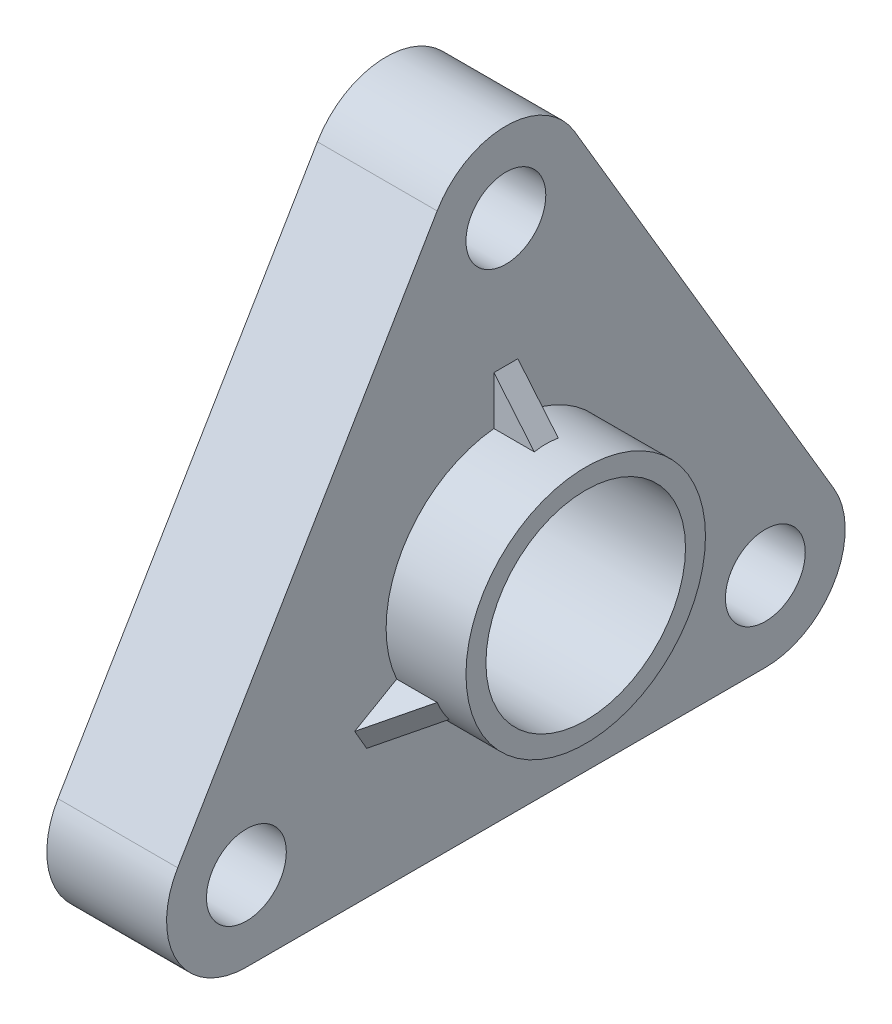
ISO-10303-21;
HEADER;
FILE_DESCRIPTION(('STEP AP214'),'2;1');
FILE_NAME('part.step','',(''),(''),'','','');
FILE_SCHEMA(('AUTOMOTIVE_DESIGN { 1 0 10303 214 1 1 1 1 }'));
ENDSEC;
DATA;
#1=APPLICATION_CONTEXT('core data for automotive mechanical design processes');
#2=APPLICATION_PROTOCOL_DEFINITION('international standard','automotive_design',2000,#1);
#3=PRODUCT_CONTEXT('',#1,'mechanical');
#4=PRODUCT('Part','Part','',(#3));
#5=PRODUCT_RELATED_PRODUCT_CATEGORY('part','',(#4));
#6=PRODUCT_DEFINITION_FORMATION('','',#4);
#7=PRODUCT_DEFINITION_CONTEXT('part definition',#1,'design');
#8=PRODUCT_DEFINITION('design','',#6,#7);
#9=PRODUCT_DEFINITION_SHAPE('','',#8);
#10=(LENGTH_UNIT() NAMED_UNIT(*) SI_UNIT(.MILLI.,.METRE.));
#11=(NAMED_UNIT(*) PLANE_ANGLE_UNIT() SI_UNIT($,.RADIAN.));
#12=(NAMED_UNIT(*) SI_UNIT($,.STERADIAN.) SOLID_ANGLE_UNIT());
#13=UNCERTAINTY_MEASURE_WITH_UNIT(LENGTH_MEASURE(1.E-05),#10,'distance_accuracy_value','');
#14=(GEOMETRIC_REPRESENTATION_CONTEXT(3) GLOBAL_UNCERTAINTY_ASSIGNED_CONTEXT((#13)) GLOBAL_UNIT_ASSIGNED_CONTEXT((#10,
#11,#12)) REPRESENTATION_CONTEXT('',''));
#15=CARTESIAN_POINT('',(0.,0.,0.));
#16=DIRECTION('',(0.,0.,1.));
#17=DIRECTION('',(1.,0.,0.));
#18=AXIS2_PLACEMENT_3D('',#15,#16,#17);
#19=CARTESIAN_POINT('',(15.,37.,0.));
#20=DIRECTION('',(1.,0.,0.));
#21=DIRECTION('',(0.,0.,-1.));
#22=AXIS2_PLACEMENT_3D('',#19,#20,#21);
#23=PLANE('',#22);
#24=DIRECTION('',(0.,0.860926528214316,0.508729312126641));
#25=VECTOR('',#24,1.);
#26=CARTESIAN_POINT('',(15.,-12.9127068787336,-41.1092652821431));
#27=LINE('',#26,#25);
#28=CARTESIAN_POINT('',(15.,-12.9127068787336,-41.1092652821431));
#29=VERTEX_POINT('',#28);
#30=CARTESIAN_POINT('',(15.,42.0872931212664,-8.60926528214315));
#31=VERTEX_POINT('',#30);
#32=EDGE_CURVE('E223',#29,#31,#27,.T.);
#33=ORIENTED_EDGE('',*,*,#32,.T.);
#34=CARTESIAN_POINT('',(15.,37.,0.));
#35=DIRECTION('',(1.,0.,0.));
#36=DIRECTION('',(0.,0.,-1.));
#37=AXIS2_PLACEMENT_3D('',#34,#35,#36);
#38=CIRCLE('',#37,9.99999999999999);
#39=CARTESIAN_POINT('',(15.,42.0872931212664,8.60926528214315));
#40=VERTEX_POINT('',#39);
#41=EDGE_CURVE('E227',#31,#40,#38,.T.);
#42=ORIENTED_EDGE('',*,*,#41,.T.);
#43=DIRECTION('',(0.,-0.860926528214316,0.508729312126641));
#44=VECTOR('',#43,1.);
#45=CARTESIAN_POINT('',(15.,-12.9127068787336,41.1092652821431));
#46=LINE('',#45,#44);
#47=CARTESIAN_POINT('',(15.,-12.9127068787336,41.1092652821431));
#48=VERTEX_POINT('',#47);
#49=EDGE_CURVE('E256',#40,#48,#46,.T.);
#50=ORIENTED_EDGE('',*,*,#49,.T.);
#51=CARTESIAN_POINT('',(15.,-18.,32.5));
#52=DIRECTION('',(1.,0.,0.));
#53=DIRECTION('',(0.,0.,-1.));
#54=AXIS2_PLACEMENT_3D('',#51,#52,#53);
#55=CIRCLE('',#54,10.);
#56=CARTESIAN_POINT('',(15.,-28.,32.5));
#57=VERTEX_POINT('',#56);
#58=EDGE_CURVE('E253',#48,#57,#55,.T.);
#59=ORIENTED_EDGE('',*,*,#58,.T.);
#60=DIRECTION('',(0.,0.,-1.));
#61=VECTOR('',#60,1.);
#62=CARTESIAN_POINT('',(15.,-28.,32.5));
#63=LINE('',#62,#61);
#64=CARTESIAN_POINT('',(15.,-28.,-32.5));
#65=VERTEX_POINT('',#64);
#66=EDGE_CURVE('E250',#57,#65,#63,.T.);
#67=ORIENTED_EDGE('',*,*,#66,.T.);
#68=CARTESIAN_POINT('',(15.,-18.,-32.5));
#69=DIRECTION('',(1.,0.,0.));
#70=DIRECTION('',(0.,0.,-1.));
#71=AXIS2_PLACEMENT_3D('',#68,#69,#70);
#72=CIRCLE('',#71,9.99999999999999);
#73=EDGE_CURVE('E247',#65,#29,#72,.T.);
#74=ORIENTED_EDGE('',*,*,#73,.T.);
#75=EDGE_LOOP('',(#33,#42,#50,#59,#67,#74));
#76=FACE_BOUND('',#75,.T.);
#77=DIRECTION('',(0.,-1.,0.));
#78=VECTOR('',#77,1.);
#79=CARTESIAN_POINT('',(15.,37.,-1.5));
#80=LINE('',#79,#78);
#81=CARTESIAN_POINT('',(15.,21.,-1.5));
#82=VERTEX_POINT('',#81);
#83=CARTESIAN_POINT('',(15.,14.9248115565993,-1.5));
#84=VERTEX_POINT('',#83);
#85=EDGE_CURVE('E303',#82,#84,#80,.T.);
#86=ORIENTED_EDGE('',*,*,#85,.T.);
#87=CARTESIAN_POINT('',(15.,0.,0.));
#88=DIRECTION('',(1.,0.,0.));
#89=DIRECTION('',(0.,0.,-1.));
#90=AXIS2_PLACEMENT_3D('',#87,#88,#89);
#91=CIRCLE('',#90,15.);
#92=CARTESIAN_POINT('',(15.,-6.16336767262305,-13.6752659547105));
#93=VERTEX_POINT('',#92);
#94=EDGE_CURVE('E163',#93,#84,#91,.T.);
#95=ORIENTED_EDGE('',*,*,#94,.F.);
#96=DIRECTION('',(0.,0.500000000000004,0.866025403784436));
#97=VECTOR('',#96,1.);
#98=CARTESIAN_POINT('',(15.,10.5490381056768,15.2714699700122));
#99=LINE('',#98,#97);
#100=CARTESIAN_POINT('',(15.,-9.20096189432343,-18.9365334794732));
#101=VERTEX_POINT('',#100);
#102=EDGE_CURVE('E318',#101,#93,#99,.T.);
#103=ORIENTED_EDGE('',*,*,#102,.F.);
#104=DIRECTION('',(0.,0.866025403784436,-0.500000000000004));
#105=VECTOR('',#104,1.);
#106=CARTESIAN_POINT('',(15.,17.2499999999998,-34.2080034494854));
#107=LINE('',#106,#105);
#108=CARTESIAN_POINT('',(15.,-11.7990381056768,-17.4365334794732));
#109=VERTEX_POINT('',#108);
#110=EDGE_CURVE('E311',#109,#101,#107,.T.);
#111=ORIENTED_EDGE('',*,*,#110,.F.);
#112=DIRECTION('',(0.,0.500000000000004,0.866025403784436));
#113=VECTOR('',#112,1.);
#114=CARTESIAN_POINT('',(15.,7.9509618943235,16.7714699700122));
#115=LINE('',#114,#113);
#116=CARTESIAN_POINT('',(15.,-8.76144388397636,-12.1752659547105));
#117=VERTEX_POINT('',#116);
#118=EDGE_CURVE('E321',#109,#117,#115,.T.);
#119=ORIENTED_EDGE('',*,*,#118,.T.);
#120=CARTESIAN_POINT('',(15.,-8.76144388397619,12.1752659547106));
#121=VERTEX_POINT('',#120);
#122=EDGE_CURVE('E161',#121,#117,#91,.T.);
#123=ORIENTED_EDGE('',*,*,#122,.F.);
#124=DIRECTION('',(0.,0.499999999999992,-0.866025403784443));
#125=VECTOR('',#124,1.);
#126=CARTESIAN_POINT('',(15.,7.95096189432305,-16.7714699700119));
#127=LINE('',#126,#125);
#128=CARTESIAN_POINT('',(15.,-11.7990381056765,17.4365334794733));
#129=VERTEX_POINT('',#128);
#130=EDGE_CURVE('E61',#129,#121,#127,.T.);
#131=ORIENTED_EDGE('',*,*,#130,.F.);
#132=DIRECTION('',(0.,-0.866025403784443,-0.499999999999992));
#133=VECTOR('',#132,1.);
#134=CARTESIAN_POINT('',(15.,17.2500000000005,34.2080034494852));
#135=LINE('',#134,#133);
#136=CARTESIAN_POINT('',(15.,-9.20096189432316,18.9365334794733));
#137=VERTEX_POINT('',#136);
#138=EDGE_CURVE('E65',#137,#129,#135,.T.);
#139=ORIENTED_EDGE('',*,*,#138,.F.);
#140=DIRECTION('',(0.,0.499999999999992,-0.866025403784443));
#141=VECTOR('',#140,1.);
#142=CARTESIAN_POINT('',(15.,10.5490381056764,-15.271469970012));
#143=LINE('',#142,#141);
#144=CARTESIAN_POINT('',(15.,-6.16336767262286,13.6752659547106));
#145=VERTEX_POINT('',#144);
#146=EDGE_CURVE('E164',#137,#145,#143,.T.);
#147=ORIENTED_EDGE('',*,*,#146,.T.);
#148=CARTESIAN_POINT('',(15.,14.9248115565993,1.5));
#149=VERTEX_POINT('',#148);
#150=EDGE_CURVE('E152',#149,#145,#91,.T.);
#151=ORIENTED_EDGE('',*,*,#150,.F.);
#152=DIRECTION('',(0.,-1.,0.));
#153=VECTOR('',#152,1.);
#154=CARTESIAN_POINT('',(15.,37.,1.5));
#155=LINE('',#154,#153);
#156=CARTESIAN_POINT('',(15.,21.,1.5));
#157=VERTEX_POINT('',#156);
#158=EDGE_CURVE('E300',#157,#149,#155,.T.);
#159=ORIENTED_EDGE('',*,*,#158,.F.);
#160=DIRECTION('',(0.,0.,1.));
#161=VECTOR('',#160,1.);
#162=CARTESIAN_POINT('',(15.,21.,0.));
#163=LINE('',#162,#161);
#164=EDGE_CURVE('E296',#82,#157,#163,.T.);
#165=ORIENTED_EDGE('',*,*,#164,.F.);
#166=EDGE_LOOP('',(#86,#95,#103,#111,#119,#123,#131,#139,#147,#151,#159,#165));
#167=FACE_BOUND('',#166,.T.);
#168=CARTESIAN_POINT('',(15.,-18.,32.5));
#169=DIRECTION('',(1.,0.,0.));
#170=DIRECTION('',(0.,0.,-1.));
#171=AXIS2_PLACEMENT_3D('',#168,#169,#170);
#172=CIRCLE('',#171,5.);
#173=CARTESIAN_POINT('',(15.,-18.,27.5));
#174=VERTEX_POINT('',#173);
#175=EDGE_CURVE('E278',#174,#174,#172,.T.);
#176=ORIENTED_EDGE('',*,*,#175,.F.);
#177=EDGE_LOOP('',(#176));
#178=FACE_BOUND('',#177,.T.);
#179=CARTESIAN_POINT('',(15.,37.,0.));
#180=DIRECTION('',(1.,0.,0.));
#181=DIRECTION('',(0.,0.,-1.));
#182=AXIS2_PLACEMENT_3D('',#179,#180,#181);
#183=CIRCLE('',#182,5.);
#184=CARTESIAN_POINT('',(15.,37.,-5.));
#185=VERTEX_POINT('',#184);
#186=EDGE_CURVE('E265',#185,#185,#183,.T.);
#187=ORIENTED_EDGE('',*,*,#186,.F.);
#188=EDGE_LOOP('',(#187));
#189=FACE_BOUND('',#188,.T.);
#190=CARTESIAN_POINT('',(15.,-18.,-32.5));
#191=DIRECTION('',(1.,0.,0.));
#192=DIRECTION('',(0.,0.,-1.));
#193=AXIS2_PLACEMENT_3D('',#190,#191,#192);
#194=CIRCLE('',#193,5.);
#195=CARTESIAN_POINT('',(15.,-18.,-37.5));
#196=VERTEX_POINT('',#195);
#197=EDGE_CURVE('E270',#196,#196,#194,.T.);
#198=ORIENTED_EDGE('',*,*,#197,.F.);
#199=EDGE_LOOP('',(#198));
#200=FACE_BOUND('',#199,.T.);
#201=ADVANCED_FACE('F45',(#76,#167,#178,#189,#200),#23,.T.);
#202=CARTESIAN_POINT('',(0.,37.,0.));
#203=DIRECTION('',(1.,0.,0.));
#204=DIRECTION('',(0.,0.,-1.));
#205=AXIS2_PLACEMENT_3D('',#202,#203,#204);
#206=PLANE('',#205);
#207=CARTESIAN_POINT('',(0.,0.,0.));
#208=DIRECTION('',(1.,0.,0.));
#209=DIRECTION('',(0.,0.,-1.));
#210=AXIS2_PLACEMENT_3D('',#207,#208,#209);
#211=CIRCLE('',#210,12.5);
#212=CARTESIAN_POINT('',(0.,0.,-12.5));
#213=VERTEX_POINT('',#212);
#214=EDGE_CURVE('E244',#213,#213,#211,.T.);
#215=ORIENTED_EDGE('',*,*,#214,.T.);
#216=EDGE_LOOP('',(#215));
#217=FACE_BOUND('',#216,.T.);
#218=CARTESIAN_POINT('',(0.,37.,0.));
#219=DIRECTION('',(1.,0.,0.));
#220=DIRECTION('',(0.,0.,-1.));
#221=AXIS2_PLACEMENT_3D('',#218,#219,#220);
#222=CIRCLE('',#221,9.99999999999999);
#223=CARTESIAN_POINT('',(0.,42.0872931212664,-8.60926528214315));
#224=VERTEX_POINT('',#223);
#225=CARTESIAN_POINT('',(0.,42.0872931212664,8.60926528214315));
#226=VERTEX_POINT('',#225);
#227=EDGE_CURVE('E240',#224,#226,#222,.T.);
#228=ORIENTED_EDGE('',*,*,#227,.F.);
#229=DIRECTION('',(0.,0.860926528214316,0.508729312126641));
#230=VECTOR('',#229,1.);
#231=CARTESIAN_POINT('',(0.,-12.9127068787336,-41.1092652821431));
#232=LINE('',#231,#230);
#233=CARTESIAN_POINT('',(0.,-12.9127068787336,-41.1092652821431));
#234=VERTEX_POINT('',#233);
#235=EDGE_CURVE('E224',#234,#224,#232,.T.);
#236=ORIENTED_EDGE('',*,*,#235,.F.);
#237=CARTESIAN_POINT('',(0.,-18.,-32.5));
#238=DIRECTION('',(1.,0.,0.));
#239=DIRECTION('',(0.,0.,-1.));
#240=AXIS2_PLACEMENT_3D('',#237,#238,#239);
#241=CIRCLE('',#240,9.99999999999999);
#242=CARTESIAN_POINT('',(0.,-28.,-32.5));
#243=VERTEX_POINT('',#242);
#244=EDGE_CURVE('E228',#243,#234,#241,.T.);
#245=ORIENTED_EDGE('',*,*,#244,.F.);
#246=DIRECTION('',(0.,0.,-1.));
#247=VECTOR('',#246,1.);
#248=CARTESIAN_POINT('',(0.,-28.,32.5));
#249=LINE('',#248,#247);
#250=CARTESIAN_POINT('',(0.,-28.,32.5));
#251=VERTEX_POINT('',#250);
#252=EDGE_CURVE('E231',#251,#243,#249,.T.);
#253=ORIENTED_EDGE('',*,*,#252,.F.);
#254=CARTESIAN_POINT('',(0.,-18.,32.5));
#255=DIRECTION('',(1.,0.,0.));
#256=DIRECTION('',(0.,0.,-1.));
#257=AXIS2_PLACEMENT_3D('',#254,#255,#256);
#258=CIRCLE('',#257,10.);
#259=CARTESIAN_POINT('',(0.,-12.9127068787336,41.1092652821431));
#260=VERTEX_POINT('',#259);
#261=EDGE_CURVE('E234',#260,#251,#258,.T.);
#262=ORIENTED_EDGE('',*,*,#261,.F.);
#263=DIRECTION('',(0.,-0.860926528214316,0.508729312126641));
#264=VECTOR('',#263,1.);
#265=CARTESIAN_POINT('',(0.,-12.9127068787336,41.1092652821431));
#266=LINE('',#265,#264);
#267=EDGE_CURVE('E237',#226,#260,#266,.T.);
#268=ORIENTED_EDGE('',*,*,#267,.F.);
#269=EDGE_LOOP('',(#228,#236,#245,#253,#262,#268));
#270=FACE_BOUND('',#269,.T.);
#271=CARTESIAN_POINT('',(0.,37.,0.));
#272=DIRECTION('',(1.,0.,0.));
#273=DIRECTION('',(0.,0.,-1.));
#274=AXIS2_PLACEMENT_3D('',#271,#272,#273);
#275=CIRCLE('',#274,5.);
#276=CARTESIAN_POINT('',(0.,37.,-5.));
#277=VERTEX_POINT('',#276);
#278=EDGE_CURVE('E266',#277,#277,#275,.T.);
#279=ORIENTED_EDGE('',*,*,#278,.T.);
#280=EDGE_LOOP('',(#279));
#281=FACE_BOUND('',#280,.T.);
#282=CARTESIAN_POINT('',(0.,-18.,-32.5));
#283=DIRECTION('',(1.,0.,0.));
#284=DIRECTION('',(0.,0.,-1.));
#285=AXIS2_PLACEMENT_3D('',#282,#283,#284);
#286=CIRCLE('',#285,5.);
#287=CARTESIAN_POINT('',(0.,-18.,-37.5));
#288=VERTEX_POINT('',#287);
#289=EDGE_CURVE('E274',#288,#288,#286,.T.);
#290=ORIENTED_EDGE('',*,*,#289,.T.);
#291=EDGE_LOOP('',(#290));
#292=FACE_BOUND('',#291,.T.);
#293=CARTESIAN_POINT('',(0.,-18.,32.5));
#294=DIRECTION('',(1.,0.,0.));
#295=DIRECTION('',(0.,0.,-1.));
#296=AXIS2_PLACEMENT_3D('',#293,#294,#295);
#297=CIRCLE('',#296,5.);
#298=CARTESIAN_POINT('',(0.,-18.,27.5));
#299=VERTEX_POINT('',#298);
#300=EDGE_CURVE('E282',#299,#299,#297,.T.);
#301=ORIENTED_EDGE('',*,*,#300,.T.);
#302=EDGE_LOOP('',(#301));
#303=FACE_BOUND('',#302,.T.);
#304=ADVANCED_FACE('F373',(#217,#270,#281,#292,#303),#206,.F.);
#305=CARTESIAN_POINT('',(15.,37.,0.));
#306=DIRECTION('',(-1.,0.,0.));
#307=DIRECTION('',(0.,0.,1.));
#308=AXIS2_PLACEMENT_3D('',#305,#306,#307);
#309=CYLINDRICAL_SURFACE('',#308,9.99999999999999);
#310=ORIENTED_EDGE('',*,*,#227,.T.);
#311=DIRECTION('',(-1.,0.,0.));
#312=VECTOR('',#311,1.);
#313=CARTESIAN_POINT('',(15.,42.0872931212664,8.60926528214315));
#314=LINE('',#313,#312);
#315=EDGE_CURVE('E199',#40,#226,#314,.T.);
#316=ORIENTED_EDGE('',*,*,#315,.F.);
#317=ORIENTED_EDGE('',*,*,#41,.F.);
#318=DIRECTION('',(-1.,0.,0.));
#319=VECTOR('',#318,1.);
#320=CARTESIAN_POINT('',(15.,42.0872931212664,-8.60926528214315));
#321=LINE('',#320,#319);
#322=EDGE_CURVE('E219',#31,#224,#321,.T.);
#323=ORIENTED_EDGE('',*,*,#322,.T.);
#324=EDGE_LOOP('',(#310,#316,#317,#323));
#325=FACE_BOUND('',#324,.T.);
#326=ADVANCED_FACE('F47',(#325),#309,.T.);
#327=CARTESIAN_POINT('',(15.,-12.9127068787336,41.1092652821431));
#328=DIRECTION('',(0.,-0.508729312126641,-0.860926528214316));
#329=DIRECTION('',(0.,0.860926528214316,-0.508729312126641));
#330=AXIS2_PLACEMENT_3D('',#327,#328,#329);
#331=PLANE('',#330);
#332=ORIENTED_EDGE('',*,*,#267,.T.);
#333=DIRECTION('',(-1.,0.,0.));
#334=VECTOR('',#333,1.);
#335=CARTESIAN_POINT('',(15.,-12.9127068787336,41.1092652821431));
#336=LINE('',#335,#334);
#337=EDGE_CURVE('E203',#48,#260,#336,.T.);
#338=ORIENTED_EDGE('',*,*,#337,.F.);
#339=ORIENTED_EDGE('',*,*,#49,.F.);
#340=ORIENTED_EDGE('',*,*,#315,.T.);
#341=EDGE_LOOP('',(#332,#338,#339,#340));
#342=FACE_BOUND('',#341,.T.);
#343=ADVANCED_FACE('F399',(#342),#331,.F.);
#344=CARTESIAN_POINT('',(15.,-18.,32.5));
#345=DIRECTION('',(-1.,0.,0.));
#346=DIRECTION('',(0.,0.,1.));
#347=AXIS2_PLACEMENT_3D('',#344,#345,#346);
#348=CYLINDRICAL_SURFACE('',#347,10.);
#349=ORIENTED_EDGE('',*,*,#261,.T.);
#350=DIRECTION('',(-1.,0.,0.));
#351=VECTOR('',#350,1.);
#352=CARTESIAN_POINT('',(15.,-28.,32.5));
#353=LINE('',#352,#351);
#354=EDGE_CURVE('E207',#57,#251,#353,.T.);
#355=ORIENTED_EDGE('',*,*,#354,.F.);
#356=ORIENTED_EDGE('',*,*,#58,.F.);
#357=ORIENTED_EDGE('',*,*,#337,.T.);
#358=EDGE_LOOP('',(#349,#355,#356,#357));
#359=FACE_BOUND('',#358,.T.);
#360=ADVANCED_FACE('F396',(#359),#348,.T.);
#361=CARTESIAN_POINT('',(15.,-28.,32.5));
#362=DIRECTION('',(0.,1.,0.));
#363=DIRECTION('',(0.,0.,1.));
#364=AXIS2_PLACEMENT_3D('',#361,#362,#363);
#365=PLANE('',#364);
#366=ORIENTED_EDGE('',*,*,#252,.T.);
#367=DIRECTION('',(-1.,0.,0.));
#368=VECTOR('',#367,1.);
#369=CARTESIAN_POINT('',(15.,-28.,-32.5));
#370=LINE('',#369,#368);
#371=EDGE_CURVE('E211',#65,#243,#370,.T.);
#372=ORIENTED_EDGE('',*,*,#371,.F.);
#373=ORIENTED_EDGE('',*,*,#66,.F.);
#374=ORIENTED_EDGE('',*,*,#354,.T.);
#375=EDGE_LOOP('',(#366,#372,#373,#374));
#376=FACE_BOUND('',#375,.T.);
#377=ADVANCED_FACE('F392',(#376),#365,.F.);
#378=CARTESIAN_POINT('',(15.,-18.,-32.5));
#379=DIRECTION('',(-1.,0.,0.));
#380=DIRECTION('',(0.,0.,1.));
#381=AXIS2_PLACEMENT_3D('',#378,#379,#380);
#382=CYLINDRICAL_SURFACE('',#381,9.99999999999999);
#383=ORIENTED_EDGE('',*,*,#244,.T.);
#384=DIRECTION('',(-1.,0.,0.));
#385=VECTOR('',#384,1.);
#386=CARTESIAN_POINT('',(15.,-12.9127068787336,-41.1092652821431));
#387=LINE('',#386,#385);
#388=EDGE_CURVE('E215',#29,#234,#387,.T.);
#389=ORIENTED_EDGE('',*,*,#388,.F.);
#390=ORIENTED_EDGE('',*,*,#73,.F.);
#391=ORIENTED_EDGE('',*,*,#371,.T.);
#392=EDGE_LOOP('',(#383,#389,#390,#391));
#393=FACE_BOUND('',#392,.T.);
#394=ADVANCED_FACE('F388',(#393),#382,.T.);
#395=CARTESIAN_POINT('',(15.,-12.9127068787336,-41.1092652821431));
#396=DIRECTION('',(0.,-0.508729312126641,0.860926528214316));
#397=DIRECTION('',(0.,-0.860926528214316,-0.508729312126641));
#398=AXIS2_PLACEMENT_3D('',#395,#396,#397);
#399=PLANE('',#398);
#400=ORIENTED_EDGE('',*,*,#235,.T.);
#401=ORIENTED_EDGE('',*,*,#322,.F.);
#402=ORIENTED_EDGE('',*,*,#32,.F.);
#403=ORIENTED_EDGE('',*,*,#388,.T.);
#404=EDGE_LOOP('',(#400,#401,#402,#403));
#405=FACE_BOUND('',#404,.T.);
#406=ADVANCED_FACE('F385',(#405),#399,.F.);
#407=CARTESIAN_POINT('',(15.,0.,0.));
#408=DIRECTION('',(-1.,0.,0.));
#409=DIRECTION('',(0.,0.,1.));
#410=AXIS2_PLACEMENT_3D('',#407,#408,#409);
#411=CYLINDRICAL_SURFACE('',#410,12.5);
#412=ORIENTED_EDGE('',*,*,#214,.F.);
#413=EDGE_LOOP('',(#412));
#414=FACE_BOUND('',#413,.T.);
#415=CARTESIAN_POINT('',(25.,0.,0.));
#416=DIRECTION('',(1.,0.,0.));
#417=DIRECTION('',(0.,0.,-1.));
#418=AXIS2_PLACEMENT_3D('',#415,#416,#417);
#419=CIRCLE('',#418,12.5);
#420=CARTESIAN_POINT('',(25.,0.,-12.5));
#421=VERTEX_POINT('',#420);
#422=EDGE_CURVE('E292',#421,#421,#419,.T.);
#423=ORIENTED_EDGE('',*,*,#422,.T.);
#424=EDGE_LOOP('',(#423));
#425=FACE_BOUND('',#424,.T.);
#426=ADVANCED_FACE('F382',(#414,#425),#411,.F.);
#427=CARTESIAN_POINT('',(15.,37.,0.));
#428=DIRECTION('',(-1.,0.,0.));
#429=DIRECTION('',(0.,0.,1.));
#430=AXIS2_PLACEMENT_3D('',#427,#428,#429);
#431=CYLINDRICAL_SURFACE('',#430,5.);
#432=ORIENTED_EDGE('',*,*,#278,.F.);
#433=EDGE_LOOP('',(#432));
#434=FACE_BOUND('',#433,.T.);
#435=ORIENTED_EDGE('',*,*,#186,.T.);
#436=EDGE_LOOP('',(#435));
#437=FACE_BOUND('',#436,.T.);
#438=ADVANCED_FACE('F444',(#434,#437),#431,.F.);
#439=CARTESIAN_POINT('',(15.,-18.,-32.5));
#440=DIRECTION('',(-1.,0.,0.));
#441=DIRECTION('',(0.,0.,1.));
#442=AXIS2_PLACEMENT_3D('',#439,#440,#441);
#443=CYLINDRICAL_SURFACE('',#442,5.);
#444=ORIENTED_EDGE('',*,*,#289,.F.);
#445=EDGE_LOOP('',(#444));
#446=FACE_BOUND('',#445,.T.);
#447=ORIENTED_EDGE('',*,*,#197,.T.);
#448=EDGE_LOOP('',(#447));
#449=FACE_BOUND('',#448,.T.);
#450=ADVANCED_FACE('F435',(#446,#449),#443,.F.);
#451=CARTESIAN_POINT('',(15.,-18.,32.5));
#452=DIRECTION('',(-1.,0.,0.));
#453=DIRECTION('',(0.,0.,1.));
#454=AXIS2_PLACEMENT_3D('',#451,#452,#453);
#455=CYLINDRICAL_SURFACE('',#454,5.);
#456=ORIENTED_EDGE('',*,*,#300,.F.);
#457=EDGE_LOOP('',(#456));
#458=FACE_BOUND('',#457,.T.);
#459=ORIENTED_EDGE('',*,*,#175,.T.);
#460=EDGE_LOOP('',(#459));
#461=FACE_BOUND('',#460,.T.);
#462=ADVANCED_FACE('F431',(#458,#461),#455,.F.);
#463=CARTESIAN_POINT('',(25.,0.,0.));
#464=DIRECTION('',(1.,0.,0.));
#465=DIRECTION('',(0.,0.,-1.));
#466=AXIS2_PLACEMENT_3D('',#463,#464,#465);
#467=PLANE('',#466);
#468=CARTESIAN_POINT('',(25.,0.,0.));
#469=DIRECTION('',(1.,0.,0.));
#470=DIRECTION('',(0.,0.,-1.));
#471=AXIS2_PLACEMENT_3D('',#468,#469,#470);
#472=CIRCLE('',#471,15.);
#473=CARTESIAN_POINT('',(25.,0.,-15.));
#474=VERTEX_POINT('',#473);
#475=EDGE_CURVE('E160',#474,#474,#472,.T.);
#476=ORIENTED_EDGE('',*,*,#475,.T.);
#477=EDGE_LOOP('',(#476));
#478=FACE_BOUND('',#477,.T.);
#479=ORIENTED_EDGE('',*,*,#422,.F.);
#480=EDGE_LOOP('',(#479));
#481=FACE_BOUND('',#480,.T.);
#482=ADVANCED_FACE('F434',(#478,#481),#467,.T.);
#483=CARTESIAN_POINT('',(25.,0.,0.));
#484=DIRECTION('',(-1.,0.,0.));
#485=DIRECTION('',(0.,0.,1.));
#486=AXIS2_PLACEMENT_3D('',#483,#484,#485);
#487=CYLINDRICAL_SURFACE('',#486,15.);
#488=ORIENTED_EDGE('',*,*,#475,.F.);
#489=EDGE_LOOP('',(#488));
#490=FACE_BOUND('',#489,.T.);
#491=ORIENTED_EDGE('',*,*,#94,.T.);
#492=DIRECTION('',(-1.,0.,0.));
#493=VECTOR('',#492,1.);
#494=CARTESIAN_POINT('',(25.,14.9248115565993,-1.5));
#495=LINE('',#494,#493);
#496=CARTESIAN_POINT('',(20.0626570361673,14.9248115565993,-1.5));
#497=VERTEX_POINT('',#496);
#498=EDGE_CURVE('E195',#497,#84,#495,.T.);
#499=ORIENTED_EDGE('',*,*,#498,.F.);
#500=CARTESIAN_POINT('',(32.5,0.,0.));
#501=DIRECTION('',(0.768221279597376,0.64018439966448,0.));
#502=DIRECTION('',(-0.64018439966448,0.768221279597376,0.));
#503=AXIS2_PLACEMENT_3D('',#500,#501,#502);
#504=ELLIPSE('',#503,19.5256241897666,15.);
#505=CARTESIAN_POINT('',(20.0626570361672,14.9248115565993,1.5));
#506=VERTEX_POINT('',#505);
#507=EDGE_CURVE('E192',#497,#506,#504,.T.);
#508=ORIENTED_EDGE('',*,*,#507,.T.);
#509=DIRECTION('',(-1.,0.,0.));
#510=VECTOR('',#509,1.);
#511=CARTESIAN_POINT('',(25.,14.9248115565993,1.5));
#512=LINE('',#511,#510);
#513=EDGE_CURVE('E158',#506,#149,#512,.T.);
#514=ORIENTED_EDGE('',*,*,#513,.T.);
#515=ORIENTED_EDGE('',*,*,#150,.T.);
#516=DIRECTION('',(-1.,0.,0.));
#517=VECTOR('',#516,1.);
#518=CARTESIAN_POINT('',(25.,-6.16336767262286,13.6752659547106));
#519=LINE('',#518,#517);
#520=CARTESIAN_POINT('',(20.0626570361673,-6.16336767262286,13.6752659547106));
#521=VERTEX_POINT('',#520);
#522=EDGE_CURVE('E155',#521,#145,#519,.T.);
#523=ORIENTED_EDGE('',*,*,#522,.F.);
#524=CARTESIAN_POINT('',(32.5,0.,0.));
#525=DIRECTION('',(0.768221279597376,-0.320092199832235,0.554415953215933));
#526=DIRECTION('',(-0.64018439966448,-0.384110639798682,0.665299143859119));
#527=AXIS2_PLACEMENT_3D('',#524,#525,#526);
#528=ELLIPSE('',#527,19.5256241897666,15.);
#529=CARTESIAN_POINT('',(20.0626570361673,-8.76144388397619,12.1752659547106));
#530=VERTEX_POINT('',#529);
#531=EDGE_CURVE('E54',#521,#530,#528,.T.);
#532=ORIENTED_EDGE('',*,*,#531,.T.);
#533=DIRECTION('',(-1.,0.,0.));
#534=VECTOR('',#533,1.);
#535=CARTESIAN_POINT('',(25.,-8.76144388397619,12.1752659547106));
#536=LINE('',#535,#534);
#537=EDGE_CURVE('E11',#530,#121,#536,.T.);
#538=ORIENTED_EDGE('',*,*,#537,.T.);
#539=ORIENTED_EDGE('',*,*,#122,.T.);
#540=DIRECTION('',(-1.,0.,0.));
#541=VECTOR('',#540,1.);
#542=CARTESIAN_POINT('',(25.,-8.76144388397636,-12.1752659547105));
#543=LINE('',#542,#541);
#544=CARTESIAN_POINT('',(20.0626570361673,-8.76144388397636,-12.1752659547105));
#545=VERTEX_POINT('',#544);
#546=EDGE_CURVE('E186',#545,#117,#543,.T.);
#547=ORIENTED_EDGE('',*,*,#546,.F.);
#548=CARTESIAN_POINT('',(32.5,0.,0.));
#549=DIRECTION('',(0.768221279597376,-0.320092199832243,-0.554415953215928));
#550=DIRECTION('',(-0.64018439966448,-0.384110639798691,-0.665299143859114));
#551=AXIS2_PLACEMENT_3D('',#548,#549,#550);
#552=ELLIPSE('',#551,19.5256241897666,15.);
#553=CARTESIAN_POINT('',(20.0626570361673,-6.16336767262305,-13.6752659547105));
#554=VERTEX_POINT('',#553);
#555=EDGE_CURVE('E181',#545,#554,#552,.T.);
#556=ORIENTED_EDGE('',*,*,#555,.T.);
#557=DIRECTION('',(-1.,0.,0.));
#558=VECTOR('',#557,1.);
#559=CARTESIAN_POINT('',(25.,-6.16336767262305,-13.6752659547105));
#560=LINE('',#559,#558);
#561=EDGE_CURVE('E176',#554,#93,#560,.T.);
#562=ORIENTED_EDGE('',*,*,#561,.T.);
#563=EDGE_LOOP('',(#491,#499,#508,#514,#515,#523,#532,#538,#539,#547,#556,#562));
#564=FACE_BOUND('',#563,.T.);
#565=ADVANCED_FACE('F153',(#490,#564),#487,.T.);
#566=CARTESIAN_POINT('',(20.,15.,0.));
#567=DIRECTION('',(0.768221279597376,0.64018439966448,0.));
#568=DIRECTION('',(-0.64018439966448,0.768221279597376,0.));
#569=AXIS2_PLACEMENT_3D('',#566,#567,#568);
#570=PLANE('',#569);
#571=DIRECTION('',(-0.64018439966448,0.768221279597376,0.));
#572=VECTOR('',#571,1.);
#573=CARTESIAN_POINT('',(20.,15.,-1.5));
#574=LINE('',#573,#572);
#575=EDGE_CURVE('E307',#497,#82,#574,.T.);
#576=ORIENTED_EDGE('',*,*,#575,.T.);
#577=ORIENTED_EDGE('',*,*,#164,.T.);
#578=DIRECTION('',(-0.64018439966448,0.768221279597376,0.));
#579=VECTOR('',#578,1.);
#580=CARTESIAN_POINT('',(20.,15.,1.5));
#581=LINE('',#580,#579);
#582=EDGE_CURVE('E306',#506,#157,#581,.T.);
#583=ORIENTED_EDGE('',*,*,#582,.F.);
#584=ORIENTED_EDGE('',*,*,#507,.F.);
#585=EDGE_LOOP('',(#576,#577,#583,#584));
#586=FACE_BOUND('',#585,.T.);
#587=ADVANCED_FACE('F358',(#586),#570,.T.);
#588=CARTESIAN_POINT('',(12.5,9.5,1.5));
#589=DIRECTION('',(0.,0.,1.));
#590=DIRECTION('',(1.,0.,0.));
#591=AXIS2_PLACEMENT_3D('',#588,#589,#590);
#592=PLANE('',#591);
#593=ORIENTED_EDGE('',*,*,#158,.T.);
#594=ORIENTED_EDGE('',*,*,#513,.F.);
#595=ORIENTED_EDGE('',*,*,#582,.T.);
#596=EDGE_LOOP('',(#593,#594,#595));
#597=FACE_BOUND('',#596,.T.);
#598=ADVANCED_FACE('F361',(#597),#592,.T.);
#599=CARTESIAN_POINT('',(12.5,9.5,-1.5));
#600=DIRECTION('',(0.,0.,1.));
#601=DIRECTION('',(1.,0.,0.));
#602=AXIS2_PLACEMENT_3D('',#599,#600,#601);
#603=PLANE('',#602);
#604=ORIENTED_EDGE('',*,*,#85,.F.);
#605=ORIENTED_EDGE('',*,*,#575,.F.);
#606=ORIENTED_EDGE('',*,*,#498,.T.);
#607=EDGE_LOOP('',(#604,#605,#606));
#608=FACE_BOUND('',#607,.T.);
#609=ADVANCED_FACE('F356',(#608),#603,.F.);
#610=CARTESIAN_POINT('',(20.,-7.50000000000006,-12.9903810567665));
#611=DIRECTION('',(0.768221279597376,-0.320092199832243,-0.554415953215928));
#612=DIRECTION('',(-0.64018439966448,-0.384110639798691,-0.665299143859114));
#613=AXIS2_PLACEMENT_3D('',#610,#611,#612);
#614=PLANE('',#613);
#615=DIRECTION('',(-0.64018439966448,-0.384110639798691,-0.665299143859114));
#616=VECTOR('',#615,1.);
#617=CARTESIAN_POINT('',(20.,-8.79903810567672,-12.2403810567665));
#618=LINE('',#617,#616);
#619=EDGE_CURVE('E326',#545,#109,#618,.T.);
#620=ORIENTED_EDGE('',*,*,#619,.T.);
#621=ORIENTED_EDGE('',*,*,#110,.T.);
#622=DIRECTION('',(-0.64018439966448,-0.384110639798691,-0.665299143859114));
#623=VECTOR('',#622,1.);
#624=CARTESIAN_POINT('',(20.,-6.20096189432341,-13.7403810567666));
#625=LINE('',#624,#623);
#626=EDGE_CURVE('E325',#554,#101,#625,.T.);
#627=ORIENTED_EDGE('',*,*,#626,.F.);
#628=ORIENTED_EDGE('',*,*,#555,.F.);
#629=EDGE_LOOP('',(#620,#621,#627,#628));
#630=FACE_BOUND('',#629,.T.);
#631=ADVANCED_FACE('F368',(#630),#614,.T.);
#632=CARTESIAN_POINT('',(12.5,3.67403810567669,3.3636206679761));
#633=DIRECTION('',(0.,0.866025403784436,-0.500000000000004));
#634=DIRECTION('',(0.,0.500000000000004,0.866025403784436));
#635=AXIS2_PLACEMENT_3D('',#632,#633,#634);
#636=PLANE('',#635);
#637=ORIENTED_EDGE('',*,*,#102,.T.);
#638=ORIENTED_EDGE('',*,*,#561,.F.);
#639=ORIENTED_EDGE('',*,*,#626,.T.);
#640=EDGE_LOOP('',(#637,#638,#639));
#641=FACE_BOUND('',#640,.T.);
#642=ADVANCED_FACE('F534',(#641),#636,.T.);
#643=CARTESIAN_POINT('',(12.5,1.07596189432338,4.86362066797611));
#644=DIRECTION('',(0.,0.866025403784436,-0.500000000000004));
#645=DIRECTION('',(0.,0.500000000000004,0.866025403784436));
#646=AXIS2_PLACEMENT_3D('',#643,#644,#645);
#647=PLANE('',#646);
#648=ORIENTED_EDGE('',*,*,#118,.F.);
#649=ORIENTED_EDGE('',*,*,#619,.F.);
#650=ORIENTED_EDGE('',*,*,#546,.T.);
#651=EDGE_LOOP('',(#648,#649,#650));
#652=FACE_BOUND('',#651,.T.);
#653=ADVANCED_FACE('F542',(#652),#647,.F.);
#654=CARTESIAN_POINT('',(20.,-7.49999999999988,12.9903810567666));
#655=DIRECTION('',(0.768221279597376,-0.320092199832235,0.554415953215933));
#656=DIRECTION('',(-0.64018439966448,-0.384110639798682,0.665299143859119));
#657=AXIS2_PLACEMENT_3D('',#654,#655,#656);
#658=PLANE('',#657);
#659=DIRECTION('',(-0.64018439966448,-0.384110639798682,0.665299143859119));
#660=VECTOR('',#659,1.);
#661=CARTESIAN_POINT('',(20.,-6.20096189432321,13.7403810567666));
#662=LINE('',#661,#660);
#663=EDGE_CURVE('E174',#521,#137,#662,.T.);
#664=ORIENTED_EDGE('',*,*,#663,.T.);
#665=ORIENTED_EDGE('',*,*,#138,.T.);
#666=DIRECTION('',(-0.64018439966448,-0.384110639798682,0.665299143859119));
#667=VECTOR('',#666,1.);
#668=CARTESIAN_POINT('',(20.,-8.79903810567654,12.2403810567667));
#669=LINE('',#668,#667);
#670=EDGE_CURVE('E171',#530,#129,#669,.T.);
#671=ORIENTED_EDGE('',*,*,#670,.F.);
#672=ORIENTED_EDGE('',*,*,#531,.F.);
#673=EDGE_LOOP('',(#664,#665,#671,#672));
#674=FACE_BOUND('',#673,.T.);
#675=ADVANCED_FACE('F346',(#674),#658,.T.);
#676=CARTESIAN_POINT('',(12.5,1.07596189432326,-4.86362066797602));
#677=DIRECTION('',(0.,-0.866025403784443,-0.499999999999992));
#678=DIRECTION('',(0.,0.499999999999992,-0.866025403784443));
#679=AXIS2_PLACEMENT_3D('',#676,#677,#678);
#680=PLANE('',#679);
#681=ORIENTED_EDGE('',*,*,#130,.T.);
#682=ORIENTED_EDGE('',*,*,#537,.F.);
#683=ORIENTED_EDGE('',*,*,#670,.T.);
#684=EDGE_LOOP('',(#681,#682,#683));
#685=FACE_BOUND('',#684,.T.);
#686=ADVANCED_FACE('F344',(#685),#680,.T.);
#687=CARTESIAN_POINT('',(12.5,3.67403810567659,-3.36362066797605));
#688=DIRECTION('',(0.,-0.866025403784443,-0.499999999999992));
#689=DIRECTION('',(0.,0.499999999999992,-0.866025403784443));
#690=AXIS2_PLACEMENT_3D('',#687,#688,#689);
#691=PLANE('',#690);
#692=ORIENTED_EDGE('',*,*,#146,.F.);
#693=ORIENTED_EDGE('',*,*,#663,.F.);
#694=ORIENTED_EDGE('',*,*,#522,.T.);
#695=EDGE_LOOP('',(#692,#693,#694));
#696=FACE_BOUND('',#695,.T.);
#697=ADVANCED_FACE('F173',(#696),#691,.F.);
#698=CLOSED_SHELL('',(#201,#304,#326,#343,#360,#377,#394,#406,#426,#438,#450,#462,#482,#565,
#587,#598,#609,#631,#642,#653,#675,#686,#697));
#699=MANIFOLD_SOLID_BREP('B2',#698);
#700=ADVANCED_BREP_SHAPE_REPRESENTATION('',(#18,#699),#14);
#701=SHAPE_DEFINITION_REPRESENTATION(#9,#700);
ENDSEC;
END-ISO-10303-21;
